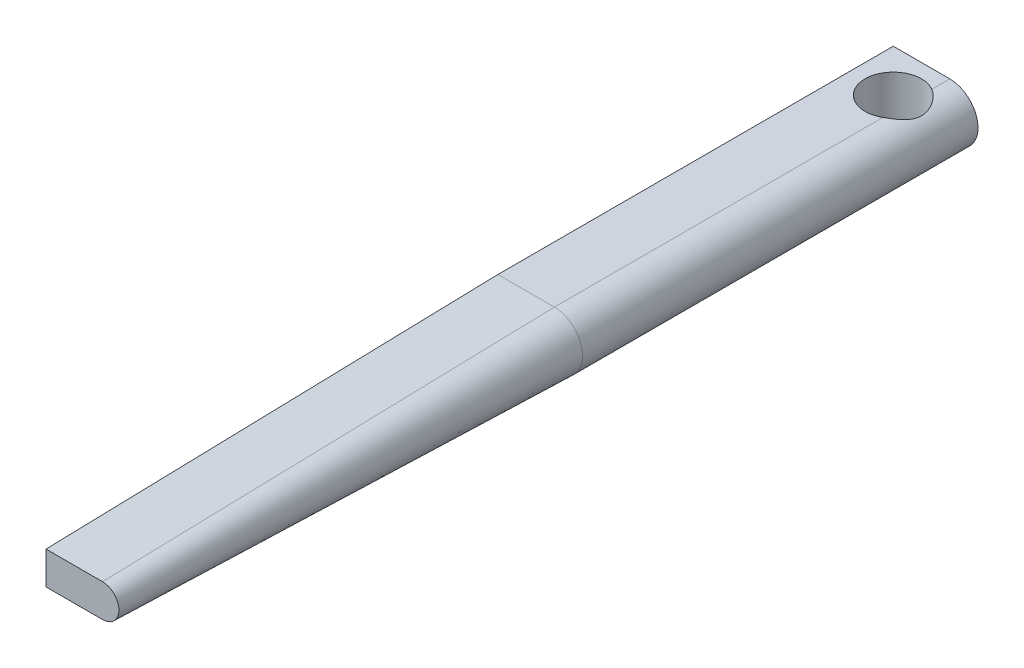
ISO-10303-21;
HEADER;
FILE_DESCRIPTION(('STEP AP214'),'2;1');
FILE_NAME('part.step','',(''),(''),'','','');
FILE_SCHEMA(('AUTOMOTIVE_DESIGN { 1 0 10303 214 1 1 1 1 }'));
ENDSEC;
DATA;
#1=APPLICATION_CONTEXT('core data for automotive mechanical design processes');
#2=APPLICATION_PROTOCOL_DEFINITION('international standard','automotive_design',2000,#1);
#3=PRODUCT_CONTEXT('',#1,'mechanical');
#4=PRODUCT('Part','Part','',(#3));
#5=PRODUCT_RELATED_PRODUCT_CATEGORY('part','',(#4));
#6=PRODUCT_DEFINITION_FORMATION('','',#4);
#7=PRODUCT_DEFINITION_CONTEXT('part definition',#1,'design');
#8=PRODUCT_DEFINITION('design','',#6,#7);
#9=PRODUCT_DEFINITION_SHAPE('','',#8);
#10=(LENGTH_UNIT() NAMED_UNIT(*) SI_UNIT(.MILLI.,.METRE.));
#11=(NAMED_UNIT(*) PLANE_ANGLE_UNIT() SI_UNIT($,.RADIAN.));
#12=(NAMED_UNIT(*) SI_UNIT($,.STERADIAN.) SOLID_ANGLE_UNIT());
#13=UNCERTAINTY_MEASURE_WITH_UNIT(LENGTH_MEASURE(1.E-05),#10,'distance_accuracy_value','');
#14=(GEOMETRIC_REPRESENTATION_CONTEXT(3) GLOBAL_UNCERTAINTY_ASSIGNED_CONTEXT((#13)) GLOBAL_UNIT_ASSIGNED_CONTEXT((#10,
#11,#12)) REPRESENTATION_CONTEXT('',''));
#15=CARTESIAN_POINT('',(0.,0.,0.));
#16=DIRECTION('',(0.,0.,1.));
#17=DIRECTION('',(1.,0.,0.));
#18=AXIS2_PLACEMENT_3D('',#15,#16,#17);
#19=CARTESIAN_POINT('',(0.,10.,150.));
#20=DIRECTION('',(1.,0.,0.));
#21=DIRECTION('',(0.,1.,0.));
#22=AXIS2_PLACEMENT_3D('',#19,#20,#21);
#23=PLANE('',#22);
#24=DIRECTION('',(0.,0.,-1.));
#25=VECTOR('',#24,1.);
#26=CARTESIAN_POINT('',(0.,0.,150.));
#27=LINE('',#26,#25);
#28=CARTESIAN_POINT('',(0.,0.,69.9999999999893));
#29=VERTEX_POINT('',#28);
#30=CARTESIAN_POINT('',(0.,0.,0.));
#31=VERTEX_POINT('',#30);
#32=EDGE_CURVE('E107',#29,#31,#27,.T.);
#33=ORIENTED_EDGE('',*,*,#32,.F.);
#34=DIRECTION('',(0.,-0.0261769483078697,-0.999657324975557));
#35=VECTOR('',#34,1.);
#36=CARTESIAN_POINT('',(0.,2.09487372553496,150.));
#37=LINE('',#36,#35);
#38=CARTESIAN_POINT('',(0.,2.09487372553496,150.));
#39=VERTEX_POINT('',#38);
#40=EDGE_CURVE('E189',#29,#39,#37,.F.);
#41=ORIENTED_EDGE('',*,*,#40,.T.);
#42=DIRECTION('',(0.,-1.,0.));
#43=VECTOR('',#42,1.);
#44=CARTESIAN_POINT('',(0.,10.,150.));
#45=LINE('',#44,#43);
#46=CARTESIAN_POINT('',(0.,7.90512627446504,150.));
#47=VERTEX_POINT('',#46);
#48=EDGE_CURVE('E202',#47,#39,#45,.T.);
#49=ORIENTED_EDGE('',*,*,#48,.F.);
#50=DIRECTION('',(0.,-0.0261769483078697,0.999657324975557));
#51=VECTOR('',#50,1.);
#52=CARTESIAN_POINT('',(0.,7.90512627446504,150.));
#53=LINE('',#52,#51);
#54=CARTESIAN_POINT('',(0.,10.,69.9999999999893));
#55=VERTEX_POINT('',#54);
#56=EDGE_CURVE('E55',#47,#55,#53,.F.);
#57=ORIENTED_EDGE('',*,*,#56,.T.);
#58=DIRECTION('',(0.,0.,-1.));
#59=VECTOR('',#58,1.);
#60=CARTESIAN_POINT('',(0.,10.,150.));
#61=LINE('',#60,#59);
#62=CARTESIAN_POINT('',(0.,10.,0.));
#63=VERTEX_POINT('',#62);
#64=EDGE_CURVE('E200',#55,#63,#61,.T.);
#65=ORIENTED_EDGE('',*,*,#64,.T.);
#66=DIRECTION('',(0.,-1.,0.));
#67=VECTOR('',#66,1.);
#68=CARTESIAN_POINT('',(0.,10.,0.));
#69=LINE('',#68,#67);
#70=EDGE_CURVE('E113',#63,#31,#69,.T.);
#71=ORIENTED_EDGE('',*,*,#70,.T.);
#72=EDGE_LOOP('',(#33,#41,#49,#57,#65,#71));
#73=FACE_BOUND('',#72,.T.);
#74=ADVANCED_FACE('F32',(#73),#23,.F.);
#75=CARTESIAN_POINT('',(0.,0.,150.));
#76=DIRECTION('',(0.,1.,0.));
#77=DIRECTION('',(0.,0.,1.));
#78=AXIS2_PLACEMENT_3D('',#75,#76,#77);
#79=PLANE('',#78);
#80=DIRECTION('',(0.,0.,-1.));
#81=VECTOR('',#80,1.);
#82=CARTESIAN_POINT('',(10.,0.,150.));
#83=LINE('',#82,#81);
#84=CARTESIAN_POINT('',(10.,0.,69.9999999999893));
#85=VERTEX_POINT('',#84);
#86=CARTESIAN_POINT('',(10.,0.,11.8301270189222));
#87=VERTEX_POINT('',#86);
#88=EDGE_CURVE('E98',#85,#87,#83,.T.);
#89=ORIENTED_EDGE('',*,*,#88,.F.);
#90=DIRECTION('',(-1.,0.,0.));
#91=VECTOR('',#90,1.);
#92=CARTESIAN_POINT('',(0.,0.,69.9999999999893));
#93=LINE('',#92,#91);
#94=EDGE_CURVE('E186',#85,#29,#93,.T.);
#95=ORIENTED_EDGE('',*,*,#94,.T.);
#96=ORIENTED_EDGE('',*,*,#32,.T.);
#97=DIRECTION('',(1.,0.,0.));
#98=VECTOR('',#97,1.);
#99=CARTESIAN_POINT('',(0.,0.,0.));
#100=LINE('',#99,#98);
#101=CARTESIAN_POINT('',(10.,0.,0.));
#102=VERTEX_POINT('',#101);
#103=EDGE_CURVE('E209',#31,#102,#100,.T.);
#104=ORIENTED_EDGE('',*,*,#103,.T.);
#105=CARTESIAN_POINT('',(10.,0.,3.16987298107779));
#106=VERTEX_POINT('',#105);
#107=EDGE_CURVE('E108',#106,#102,#83,.T.);
#108=ORIENTED_EDGE('',*,*,#107,.F.);
#109=CARTESIAN_POINT('',(7.5,0.,7.49999999999999));
#110=DIRECTION('',(0.,1.,0.));
#111=DIRECTION('',(0.,0.,1.));
#112=AXIS2_PLACEMENT_3D('',#109,#110,#111);
#113=CIRCLE('',#112,5.);
#114=EDGE_CURVE('E112',#106,#87,#113,.T.);
#115=ORIENTED_EDGE('',*,*,#114,.T.);
#116=EDGE_LOOP('',(#89,#95,#96,#104,#108,#115));
#117=FACE_BOUND('',#116,.T.);
#118=ADVANCED_FACE('F116',(#117),#79,.F.);
#119=CARTESIAN_POINT('',(10.,5.,150.));
#120=DIRECTION('',(0.,0.,-1.));
#121=DIRECTION('',(-1.,0.,0.));
#122=AXIS2_PLACEMENT_3D('',#119,#120,#121);
#123=CYLINDRICAL_SURFACE('',#122,5.);
#124=DIRECTION('',(0.,0.,-1.));
#125=VECTOR('',#124,1.);
#126=CARTESIAN_POINT('',(10.,10.,150.));
#127=LINE('',#126,#125);
#128=CARTESIAN_POINT('',(10.,10.,69.9999999999893));
#129=VERTEX_POINT('',#128);
#130=CARTESIAN_POINT('',(10.,10.,11.8301270189222));
#131=VERTEX_POINT('',#130);
#132=EDGE_CURVE('E197',#129,#131,#127,.T.);
#133=ORIENTED_EDGE('',*,*,#132,.F.);
#134=CARTESIAN_POINT('',(10.,5.,69.9999999999893));
#135=DIRECTION('',(0.,0.,-1.));
#136=DIRECTION('',(-1.,0.,0.));
#137=AXIS2_PLACEMENT_3D('',#134,#135,#136);
#138=CIRCLE('',#137,5.);
#139=EDGE_CURVE('E41',#129,#85,#138,.T.);
#140=ORIENTED_EDGE('',*,*,#139,.T.);
#141=ORIENTED_EDGE('',*,*,#88,.T.);
#142=CARTESIAN_POINT('',(10.,0.,11.8301270189222));
#143=CARTESIAN_POINT('',(10.1158095749763,-1.41932239396279E-05,11.7632927825264));
#144=CARTESIAN_POINT('',(10.2288406200287,0.004022136951135,11.6918137530019));
#145=CARTESIAN_POINT('',(10.448395044528,0.0189366187205131,11.5403788717469));
#146=CARTESIAN_POINT('',(10.5549266568575,0.0298059088871251,11.4604341104207));
#147=CARTESIAN_POINT('',(10.7602215772314,0.0570520389723175,11.293203951597));
#148=CARTESIAN_POINT('',(10.8590274226486,0.0733956483218827,11.2059651727145));
#149=CARTESIAN_POINT('',(11.0490481757933,0.110329726396959,11.0244215070913));
#150=CARTESIAN_POINT('',(11.1402606312038,0.130921559693788,10.9301143561325));
#151=CARTESIAN_POINT('',(11.4010714418943,0.196978225106135,10.6383705900926));
#152=CARTESIAN_POINT('',(11.5589581642362,0.246898277728612,10.4311978392689));
#153=CARTESIAN_POINT('',(11.7701555149806,0.323227987055816,10.1043647564168));
#154=CARTESIAN_POINT('',(11.8363615319779,0.34895203825514,9.99256370414784));
#155=CARTESIAN_POINT('',(11.9599660676356,0.399675265949313,9.76397082803114));
#156=CARTESIAN_POINT('',(12.0173637209088,0.424674371025615,9.64717851525086));
#157=CARTESIAN_POINT('',(12.1281676399765,0.475072713785705,9.39749937907722));
#158=CARTESIAN_POINT('',(12.180635868027,0.500272361161182,9.26415502783635));
#159=CARTESIAN_POINT('',(12.2740806430931,0.546767189332916,8.99288898544973));
#160=CARTESIAN_POINT('',(12.3150622697174,0.568064094554077,8.85496934786126));
#161=CARTESIAN_POINT('',(12.3850479463428,0.60533044553526,8.57564001152183));
#162=CARTESIAN_POINT('',(12.4140709361931,0.621308307719138,8.434236210347));
#163=CARTESIAN_POINT('',(12.4598203851795,0.646842896091124,8.1488841820357));
#164=CARTESIAN_POINT('',(12.4765488067765,0.656400647037461,8.00493636473352));
#165=CARTESIAN_POINT('',(12.4965307431455,0.667858367537892,7.72844152336621));
#166=CARTESIAN_POINT('',(12.5008314227902,0.670353053011175,7.595994067421));
#167=CARTESIAN_POINT('',(12.4989035857203,0.669239921224166,7.3312064847842));
#168=CARTESIAN_POINT('',(12.4926755665282,0.665632392317499,7.19886635331675));
#169=CARTESIAN_POINT('',(12.4697743794442,0.652542308032284,6.93534436918492));
#170=CARTESIAN_POINT('',(12.4530978723164,0.643057874462397,6.80416290041499));
#171=CARTESIAN_POINT('',(12.4095366700614,0.618819597663814,6.54403811539103));
#172=CARTESIAN_POINT('',(12.3826518337825,0.604065681573541,6.4150948301104));
#173=CARTESIAN_POINT('',(12.2912653600638,0.555372032925041,6.04950425101976));
#174=CARTESIAN_POINT('',(12.2143723607128,0.515898045904103,5.81657446606786));
#175=CARTESIAN_POINT('',(12.0281921855034,0.42868114961387,5.36570355239188));
#176=CARTESIAN_POINT('',(11.918867595674,0.380928716691752,5.14778009511156));
#177=CARTESIAN_POINT('',(11.6527112901255,0.278614127046543,4.70158065476627));
#178=CARTESIAN_POINT('',(11.4914463137793,0.224007124153937,4.47591196334191));
#179=CARTESIAN_POINT('',(11.2225440797808,0.150875181847769,4.15906351452558));
#180=CARTESIAN_POINT('',(11.1284825817548,0.127973602075447,4.05711866030321));
#181=CARTESIAN_POINT('',(10.9317363360125,0.0865525710214413,3.86098125205507));
#182=CARTESIAN_POINT('',(10.8290559025419,0.0680309448498792,3.76678486570349));
#183=CARTESIAN_POINT('',(10.6102363394946,0.0360878249925293,3.58236145842762));
#184=CARTESIAN_POINT('',(10.4936795976481,0.0229706923196825,3.49257428241356));
#185=CARTESIAN_POINT('',(10.2525593062208,0.004911796303437,3.32324959974892));
#186=CARTESIAN_POINT('',(10.1279862515261,-2.00688895273E-05,3.24372460975588));
#187=CARTESIAN_POINT('',(9.99999999999999,0.,3.1698729810778));
#188=B_SPLINE_CURVE_WITH_KNOTS('',3,(#142,#143,#144,#145,#146,#147,#148,#149,#150,#151,#152,
#153,#154,#155,#156,#157,#158,#159,#160,#161,#162,#163,#164,#165,#166,#167,#168,#169,#170,#171,
#172,#173,#174,#175,#176,#177,#178,#179,#180,#181,#182,#183,#184,#185,#186,#187),.UNSPECIFIED.,
.F.,.F.,(4,2,2,2,2,2,2,2,2,2,2,2,2,2,2,2,2,2,2,2,2,2,4),(0.,0.400839370603952,0.801159975962347,
1.19909328729396,1.5971546182873,2.38897065071449,2.78605757219177,3.18318348096169,
3.61911386442946,4.05485116536628,4.48989567679929,4.92487073126644,5.32194260539755,
5.71899571684537,6.11617578740865,6.51336135002667,7.25549410003319,7.99848634631314,
8.84229015368389,9.2636174338146,9.68473506020486,10.1270931180355,10.5699857148805),.UNSPECIFIED.);
#189=EDGE_CURVE('E101',#87,#106,#188,.T.);
#190=ORIENTED_EDGE('',*,*,#189,.T.);
#191=ORIENTED_EDGE('',*,*,#107,.T.);
#192=CARTESIAN_POINT('',(10.,5.,0.));
#193=DIRECTION('',(0.,0.,1.));
#194=DIRECTION('',(-1.,0.,0.));
#195=AXIS2_PLACEMENT_3D('',#192,#193,#194);
#196=CIRCLE('',#195,5.);
#197=CARTESIAN_POINT('',(10.,10.,0.));
#198=VERTEX_POINT('',#197);
#199=EDGE_CURVE('E206',#102,#198,#196,.T.);
#200=ORIENTED_EDGE('',*,*,#199,.T.);
#201=CARTESIAN_POINT('',(10.,10.,3.1698729810778));
#202=VERTEX_POINT('',#201);
#203=EDGE_CURVE('E199',#202,#198,#127,.T.);
#204=ORIENTED_EDGE('',*,*,#203,.F.);
#205=CARTESIAN_POINT('',(10.,10.,3.16987298107778));
#206=CARTESIAN_POINT('',(10.1158095749763,10.0000141932239,3.23670721747354));
#207=CARTESIAN_POINT('',(10.2288406200286,9.99597786304887,3.30818624699809));
#208=CARTESIAN_POINT('',(10.448395044528,9.98106338127949,3.45962112825311));
#209=CARTESIAN_POINT('',(10.5549266568575,9.97019409111288,3.53956588957931));
#210=CARTESIAN_POINT('',(10.7602215772314,9.94294796102768,3.70679604840297));
#211=CARTESIAN_POINT('',(10.8590274226486,9.92660435167812,3.79403482728545));
#212=CARTESIAN_POINT('',(11.0490481757933,9.88967027360304,3.97557849290868));
#213=CARTESIAN_POINT('',(11.1402606312037,9.86907844030621,4.06988564386744));
#214=CARTESIAN_POINT('',(11.4010714418942,9.80302177489387,4.36162940990735));
#215=CARTESIAN_POINT('',(11.5589581642362,9.75310172227139,4.56880216073104));
#216=CARTESIAN_POINT('',(11.7701555149806,9.67677201294419,4.89563524358318));
#217=CARTESIAN_POINT('',(11.8363615319779,9.65104796174486,5.00743629585214));
#218=CARTESIAN_POINT('',(11.9599660676356,9.60032473405069,5.23602917196884));
#219=CARTESIAN_POINT('',(12.0173637209088,9.57532562897439,5.35282148474911));
#220=CARTESIAN_POINT('',(12.1281676399765,9.5249272862143,5.60250062092275));
#221=CARTESIAN_POINT('',(12.180635868027,9.49972763883882,5.73584497216363));
#222=CARTESIAN_POINT('',(12.2740806430931,9.45323281066709,6.00711101455025));
#223=CARTESIAN_POINT('',(12.3150622697174,9.43193590544593,6.14503065213872));
#224=CARTESIAN_POINT('',(12.3850479463428,9.39466955446474,6.42435998847814));
#225=CARTESIAN_POINT('',(12.4140709361931,9.37869169228086,6.56576378965298));
#226=CARTESIAN_POINT('',(12.4598203851795,9.35315710390888,6.85111581796427));
#227=CARTESIAN_POINT('',(12.4765488067765,9.34359935296254,6.99506363526646));
#228=CARTESIAN_POINT('',(12.4965307431455,9.33214163246211,7.27155847663377));
#229=CARTESIAN_POINT('',(12.5008314227902,9.32964694698883,7.40400593257897));
#230=CARTESIAN_POINT('',(12.4989035857204,9.33076007877583,7.66879351521577));
#231=CARTESIAN_POINT('',(12.4926755665282,9.3343676076825,7.80113364668323));
#232=CARTESIAN_POINT('',(12.4697743794442,9.34745769196772,8.06465563081505));
#233=CARTESIAN_POINT('',(12.4530978723164,9.35694212553761,8.19583709958498));
#234=CARTESIAN_POINT('',(12.4095366700614,9.38118040233619,8.45596188460894));
#235=CARTESIAN_POINT('',(12.3826518337825,9.39593431842646,8.58490516988958));
#236=CARTESIAN_POINT('',(12.2912653600638,9.44462796707496,8.95049574898021));
#237=CARTESIAN_POINT('',(12.2143723607128,9.48410195409589,9.18342553393212));
#238=CARTESIAN_POINT('',(12.0281921855034,9.57131885038613,9.6342964476081));
#239=CARTESIAN_POINT('',(11.918867595674,9.61907128330825,9.85221990488841));
#240=CARTESIAN_POINT('',(11.6527112901255,9.72138587295346,10.2984193452337));
#241=CARTESIAN_POINT('',(11.4914463137793,9.77599287584606,10.5240880366581));
#242=CARTESIAN_POINT('',(11.2225440797808,9.84912481815223,10.8409364854744));
#243=CARTESIAN_POINT('',(11.1284825817548,9.87202639792455,10.9428813396968));
#244=CARTESIAN_POINT('',(10.9317363360125,9.91344742897856,11.1390187479449));
#245=CARTESIAN_POINT('',(10.829055902542,9.93196905515012,11.2332151342965));
#246=CARTESIAN_POINT('',(10.6102363394946,9.96391217500747,11.4176385415724));
#247=CARTESIAN_POINT('',(10.4936795976481,9.97702930768032,11.5074257175864));
#248=CARTESIAN_POINT('',(10.2525593062208,9.99508820369656,11.6767504002511));
#249=CARTESIAN_POINT('',(10.1279862515261,10.0000200688895,11.7562753902441));
#250=CARTESIAN_POINT('',(10.,10.,11.8301270189222));
#251=B_SPLINE_CURVE_WITH_KNOTS('',3,(#205,#206,#207,#208,#209,#210,#211,#212,#213,#214,#215,
#216,#217,#218,#219,#220,#221,#222,#223,#224,#225,#226,#227,#228,#229,#230,#231,#232,#233,#234,
#235,#236,#237,#238,#239,#240,#241,#242,#243,#244,#245,#246,#247,#248,#249,#250),.UNSPECIFIED.,
.F.,.F.,(4,2,2,2,2,2,2,2,2,2,2,2,2,2,2,2,2,2,2,2,2,2,4),(0.,0.400839370603951,0.801159975962347,
1.19909328729396,1.5971546182873,2.38897065071449,2.78605757219177,3.1831834809617,
3.61911386442947,4.05485116536629,4.4898956767993,4.92487073126645,5.32194260539756,
5.71899571684537,6.11617578740865,6.51336135002668,7.2554941000332,7.99848634631315,
8.84229015368389,9.26361743381461,9.68473506020487,10.1270931180355,10.5699857148805),.UNSPECIFIED.);
#252=EDGE_CURVE('E114',#202,#131,#251,.T.);
#253=ORIENTED_EDGE('',*,*,#252,.T.);
#254=EDGE_LOOP('',(#133,#140,#141,#190,#191,#200,#204,#253));
#255=FACE_BOUND('',#254,.T.);
#256=ADVANCED_FACE('F100',(#255),#123,.T.);
#257=CARTESIAN_POINT('',(0.,10.,150.));
#258=DIRECTION('',(0.,-1.,0.));
#259=DIRECTION('',(0.,0.,-1.));
#260=AXIS2_PLACEMENT_3D('',#257,#258,#259);
#261=PLANE('',#260);
#262=ORIENTED_EDGE('',*,*,#64,.F.);
#263=DIRECTION('',(1.,0.,0.));
#264=VECTOR('',#263,1.);
#265=CARTESIAN_POINT('',(0.,10.,69.9999999999893));
#266=LINE('',#265,#264);
#267=EDGE_CURVE('E11',#55,#129,#266,.T.);
#268=ORIENTED_EDGE('',*,*,#267,.T.);
#269=ORIENTED_EDGE('',*,*,#132,.T.);
#270=CARTESIAN_POINT('',(7.5,10.,7.49999999999999));
#271=DIRECTION('',(0.,-1.,0.));
#272=DIRECTION('',(0.,0.,-1.));
#273=AXIS2_PLACEMENT_3D('',#270,#271,#272);
#274=CIRCLE('',#273,5.);
#275=EDGE_CURVE('E177',#131,#202,#274,.T.);
#276=ORIENTED_EDGE('',*,*,#275,.T.);
#277=ORIENTED_EDGE('',*,*,#203,.T.);
#278=DIRECTION('',(-1.,0.,0.));
#279=VECTOR('',#278,1.);
#280=CARTESIAN_POINT('',(0.,10.,0.));
#281=LINE('',#280,#279);
#282=EDGE_CURVE('E203',#198,#63,#281,.T.);
#283=ORIENTED_EDGE('',*,*,#282,.T.);
#284=EDGE_LOOP('',(#262,#268,#269,#276,#277,#283));
#285=FACE_BOUND('',#284,.T.);
#286=ADVANCED_FACE('F144',(#285),#261,.F.);
#287=CARTESIAN_POINT('',(10.,5.,150.));
#288=DIRECTION('',(0.,0.,-1.));
#289=DIRECTION('',(-1.,0.,0.));
#290=AXIS2_PLACEMENT_3D('',#287,#288,#289);
#291=PLANE('',#290);
#292=ORIENTED_EDGE('',*,*,#48,.T.);
#293=DIRECTION('',(1.,0.,0.));
#294=VECTOR('',#293,1.);
#295=CARTESIAN_POINT('',(10.,2.09487372553496,150.));
#296=LINE('',#295,#294);
#297=CARTESIAN_POINT('',(10.,2.09487372553496,150.));
#298=VERTEX_POINT('',#297);
#299=EDGE_CURVE('E179',#39,#298,#296,.T.);
#300=ORIENTED_EDGE('',*,*,#299,.T.);
#301=CARTESIAN_POINT('',(10.,5.,150.));
#302=DIRECTION('',(0.,0.,-1.));
#303=DIRECTION('',(-1.,0.,0.));
#304=AXIS2_PLACEMENT_3D('',#301,#302,#303);
#305=CIRCLE('',#304,2.90512627446504);
#306=CARTESIAN_POINT('',(10.,7.90512627446504,150.));
#307=VERTEX_POINT('',#306);
#308=EDGE_CURVE('E172',#298,#307,#305,.F.);
#309=ORIENTED_EDGE('',*,*,#308,.T.);
#310=DIRECTION('',(-1.,0.,0.));
#311=VECTOR('',#310,1.);
#312=CARTESIAN_POINT('',(10.,7.90512627446504,150.));
#313=LINE('',#312,#311);
#314=EDGE_CURVE('E175',#307,#47,#313,.T.);
#315=ORIENTED_EDGE('',*,*,#314,.T.);
#316=EDGE_LOOP('',(#292,#300,#309,#315));
#317=FACE_BOUND('',#316,.T.);
#318=ADVANCED_FACE('F140',(#317),#291,.F.);
#319=CARTESIAN_POINT('',(10.,5.,0.));
#320=DIRECTION('',(0.,0.,-1.));
#321=DIRECTION('',(-1.,0.,0.));
#322=AXIS2_PLACEMENT_3D('',#319,#320,#321);
#323=PLANE('',#322);
#324=ORIENTED_EDGE('',*,*,#70,.F.);
#325=ORIENTED_EDGE('',*,*,#282,.F.);
#326=ORIENTED_EDGE('',*,*,#199,.F.);
#327=ORIENTED_EDGE('',*,*,#103,.F.);
#328=EDGE_LOOP('',(#324,#325,#326,#327));
#329=FACE_BOUND('',#328,.T.);
#330=ADVANCED_FACE('F138',(#329),#323,.T.);
#331=CARTESIAN_POINT('',(7.5,0.,7.49999999999999));
#332=DIRECTION('',(0.,1.,0.));
#333=DIRECTION('',(0.,0.,1.));
#334=AXIS2_PLACEMENT_3D('',#331,#332,#333);
#335=CYLINDRICAL_SURFACE('',#334,5.);
#336=ORIENTED_EDGE('',*,*,#275,.F.);
#337=ORIENTED_EDGE('',*,*,#252,.F.);
#338=EDGE_LOOP('',(#336,#337));
#339=FACE_BOUND('',#338,.T.);
#340=ORIENTED_EDGE('',*,*,#114,.F.);
#341=ORIENTED_EDGE('',*,*,#189,.F.);
#342=EDGE_LOOP('',(#340,#341));
#343=FACE_BOUND('',#342,.T.);
#344=ADVANCED_FACE('F111',(#339,#343),#335,.F.);
#345=CARTESIAN_POINT('',(10.,7.90512627446504,150.));
#346=DIRECTION('',(0.,-0.999657324975557,-0.0261769483078697));
#347=DIRECTION('',(0.,0.0261769483078697,-0.999657324975557));
#348=AXIS2_PLACEMENT_3D('',#345,#346,#347);
#349=PLANE('',#348);
#350=ORIENTED_EDGE('',*,*,#56,.F.);
#351=ORIENTED_EDGE('',*,*,#314,.F.);
#352=DIRECTION('',(0.,-0.0261769483078697,0.999657324975557));
#353=VECTOR('',#352,1.);
#354=CARTESIAN_POINT('',(10.,10.,69.9999999999893));
#355=LINE('',#354,#353);
#356=EDGE_CURVE('E36',#129,#307,#355,.T.);
#357=ORIENTED_EDGE('',*,*,#356,.F.);
#358=ORIENTED_EDGE('',*,*,#267,.F.);
#359=EDGE_LOOP('',(#350,#351,#357,#358));
#360=FACE_BOUND('',#359,.T.);
#361=ADVANCED_FACE('F34',(#360),#349,.F.);
#362=CARTESIAN_POINT('',(10.,5.,150.));
#363=DIRECTION('',(0.,0.,-1.));
#364=DIRECTION('',(-1.,0.,0.));
#365=AXIS2_PLACEMENT_3D('',#362,#363,#364);
#366=CONICAL_SURFACE('',#365,2.90512627446504,0.0261799387799115);
#367=ORIENTED_EDGE('',*,*,#356,.T.);
#368=ORIENTED_EDGE('',*,*,#308,.F.);
#369=DIRECTION('',(0.,0.0261769483078697,0.999657324975557));
#370=VECTOR('',#369,1.);
#371=CARTESIAN_POINT('',(10.,0.,69.9999999999893));
#372=LINE('',#371,#370);
#373=EDGE_CURVE('E122',#85,#298,#372,.T.);
#374=ORIENTED_EDGE('',*,*,#373,.F.);
#375=ORIENTED_EDGE('',*,*,#139,.F.);
#376=EDGE_LOOP('',(#367,#368,#374,#375));
#377=FACE_BOUND('',#376,.T.);
#378=ADVANCED_FACE('F161',(#377),#366,.T.);
#379=CARTESIAN_POINT('',(10.,2.09487372553496,150.));
#380=DIRECTION('',(0.,0.999657324975557,-0.0261769483078697));
#381=DIRECTION('',(0.,0.0261769483078697,0.999657324975557));
#382=AXIS2_PLACEMENT_3D('',#379,#380,#381);
#383=PLANE('',#382);
#384=ORIENTED_EDGE('',*,*,#40,.F.);
#385=ORIENTED_EDGE('',*,*,#94,.F.);
#386=ORIENTED_EDGE('',*,*,#373,.T.);
#387=ORIENTED_EDGE('',*,*,#299,.F.);
#388=EDGE_LOOP('',(#384,#385,#386,#387));
#389=FACE_BOUND('',#388,.T.);
#390=ADVANCED_FACE('F159',(#389),#383,.F.);
#391=CLOSED_SHELL('',(#74,#118,#256,#286,#318,#330,#344,#361,#378,#390));
#392=MANIFOLD_SOLID_BREP('B2',#391);
#393=ADVANCED_BREP_SHAPE_REPRESENTATION('',(#18,#392),#14);
#394=SHAPE_DEFINITION_REPRESENTATION(#9,#393);
ENDSEC;
END-ISO-10303-21;
